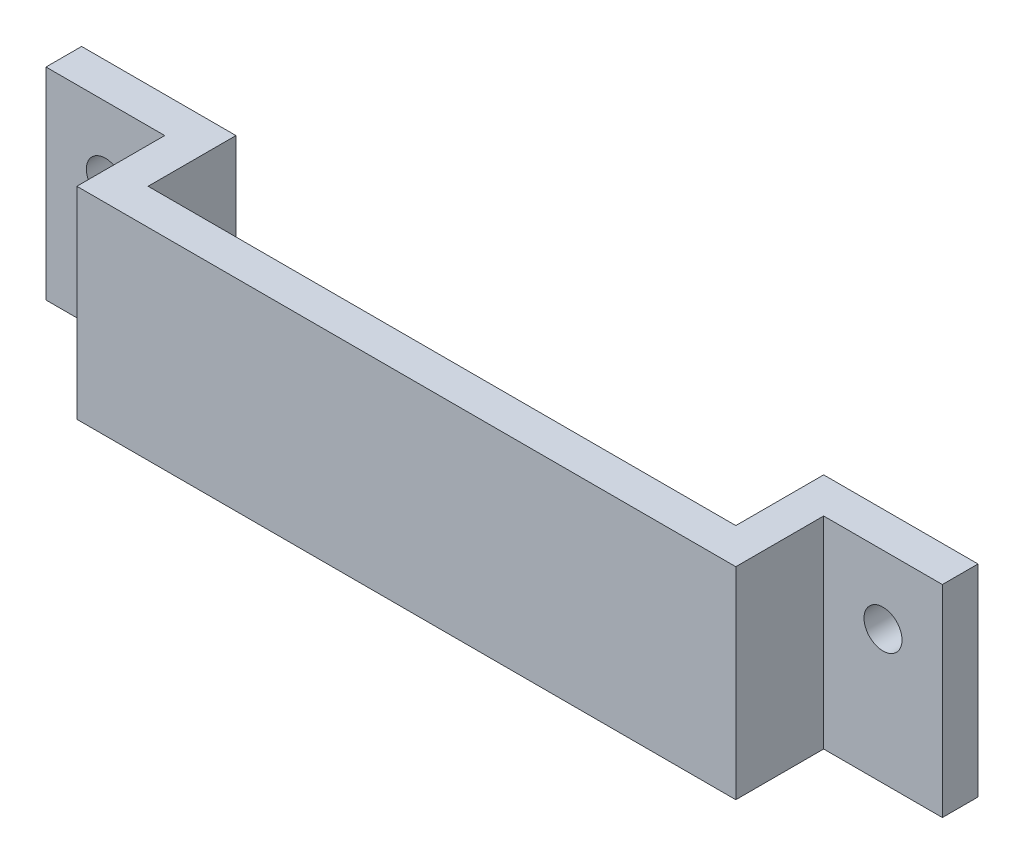
ISO-10303-21;
HEADER;
FILE_DESCRIPTION(('STEP AP214'),'2;1');
FILE_NAME('part.step','',(''),(''),'','','');
FILE_SCHEMA(('AUTOMOTIVE_DESIGN { 1 0 10303 214 1 1 1 1 }'));
ENDSEC;
DATA;
#1=APPLICATION_CONTEXT('core data for automotive mechanical design processes');
#2=APPLICATION_PROTOCOL_DEFINITION('international standard','automotive_design',2000,#1);
#3=PRODUCT_CONTEXT('',#1,'mechanical');
#4=PRODUCT('Part','Part','',(#3));
#5=PRODUCT_RELATED_PRODUCT_CATEGORY('part','',(#4));
#6=PRODUCT_DEFINITION_FORMATION('','',#4);
#7=PRODUCT_DEFINITION_CONTEXT('part definition',#1,'design');
#8=PRODUCT_DEFINITION('design','',#6,#7);
#9=PRODUCT_DEFINITION_SHAPE('','',#8);
#10=(LENGTH_UNIT() NAMED_UNIT(*) SI_UNIT(.MILLI.,.METRE.));
#11=(NAMED_UNIT(*) PLANE_ANGLE_UNIT() SI_UNIT($,.RADIAN.));
#12=(NAMED_UNIT(*) SI_UNIT($,.STERADIAN.) SOLID_ANGLE_UNIT());
#13=UNCERTAINTY_MEASURE_WITH_UNIT(LENGTH_MEASURE(1.E-05),#10,'distance_accuracy_value','');
#14=(GEOMETRIC_REPRESENTATION_CONTEXT(3) GLOBAL_UNCERTAINTY_ASSIGNED_CONTEXT((#13)) GLOBAL_UNIT_ASSIGNED_CONTEXT((#10,
#11,#12)) REPRESENTATION_CONTEXT('',''));
#15=CARTESIAN_POINT('',(0.,0.,0.));
#16=DIRECTION('',(0.,0.,1.));
#17=DIRECTION('',(1.,0.,0.));
#18=AXIS2_PLACEMENT_3D('',#15,#16,#17);
#19=CARTESIAN_POINT('',(-27.75,8.5,3.));
#20=DIRECTION('',(1.,0.,0.));
#21=DIRECTION('',(0.,0.,-1.));
#22=AXIS2_PLACEMENT_3D('',#19,#20,#21);
#23=PLANE('',#22);
#24=DIRECTION('',(0.,1.,0.));
#25=VECTOR('',#24,1.);
#26=CARTESIAN_POINT('',(-27.75,-8.5,-4.39999999999999));
#27=LINE('',#26,#25);
#28=CARTESIAN_POINT('',(-27.75,-8.5,-4.39999999999999));
#29=VERTEX_POINT('',#28);
#30=CARTESIAN_POINT('',(-27.75,8.5,-4.39999999999999));
#31=VERTEX_POINT('',#30);
#32=EDGE_CURVE('E55',#29,#31,#27,.T.);
#33=ORIENTED_EDGE('',*,*,#32,.F.);
#34=DIRECTION('',(0.,0.,-1.));
#35=VECTOR('',#34,1.);
#36=CARTESIAN_POINT('',(-27.75,-8.5,3.));
#37=LINE('',#36,#35);
#38=CARTESIAN_POINT('',(-27.75,-8.5,3.));
#39=VERTEX_POINT('',#38);
#40=EDGE_CURVE('E11',#39,#29,#37,.T.);
#41=ORIENTED_EDGE('',*,*,#40,.F.);
#42=DIRECTION('',(0.,-1.,0.));
#43=VECTOR('',#42,1.);
#44=CARTESIAN_POINT('',(-27.75,8.5,3.));
#45=LINE('',#44,#43);
#46=CARTESIAN_POINT('',(-27.75,8.5,3.));
#47=VERTEX_POINT('',#46);
#48=EDGE_CURVE('E157',#47,#39,#45,.T.);
#49=ORIENTED_EDGE('',*,*,#48,.F.);
#50=DIRECTION('',(0.,0.,-1.));
#51=VECTOR('',#50,1.);
#52=CARTESIAN_POINT('',(-27.75,8.5,3.));
#53=LINE('',#52,#51);
#54=EDGE_CURVE('E149',#47,#31,#53,.T.);
#55=ORIENTED_EDGE('',*,*,#54,.T.);
#56=EDGE_LOOP('',(#33,#41,#49,#55));
#57=FACE_BOUND('',#56,.T.);
#58=ADVANCED_FACE('F41',(#57),#23,.F.);
#59=CARTESIAN_POINT('',(0.,0.,0.));
#60=DIRECTION('',(0.,0.,1.));
#61=DIRECTION('',(1.,0.,0.));
#62=AXIS2_PLACEMENT_3D('',#59,#60,#61);
#63=PLANE('',#62);
#64=DIRECTION('',(-1.,0.,0.));
#65=VECTOR('',#64,1.);
#66=CARTESIAN_POINT('',(-27.75,8.5,0.));
#67=LINE('',#66,#65);
#68=CARTESIAN_POINT('',(24.75,8.5,0.));
#69=VERTEX_POINT('',#68);
#70=CARTESIAN_POINT('',(-24.75,8.5,0.));
#71=VERTEX_POINT('',#70);
#72=EDGE_CURVE('E154',#69,#71,#67,.T.);
#73=ORIENTED_EDGE('',*,*,#72,.F.);
#74=DIRECTION('',(0.,-1.,0.));
#75=VECTOR('',#74,1.);
#76=CARTESIAN_POINT('',(24.75,0.,0.));
#77=LINE('',#76,#75);
#78=CARTESIAN_POINT('',(24.75,-8.5,0.));
#79=VERTEX_POINT('',#78);
#80=EDGE_CURVE('E171',#69,#79,#77,.T.);
#81=ORIENTED_EDGE('',*,*,#80,.T.);
#82=DIRECTION('',(1.,0.,0.));
#83=VECTOR('',#82,1.);
#84=CARTESIAN_POINT('',(-27.75,-8.5,0.));
#85=LINE('',#84,#83);
#86=CARTESIAN_POINT('',(-24.75,-8.5,0.));
#87=VERTEX_POINT('',#86);
#88=EDGE_CURVE('E158',#87,#79,#85,.T.);
#89=ORIENTED_EDGE('',*,*,#88,.F.);
#90=DIRECTION('',(0.,-1.,0.));
#91=VECTOR('',#90,1.);
#92=CARTESIAN_POINT('',(-24.75,0.,0.));
#93=LINE('',#92,#91);
#94=EDGE_CURVE('E176',#71,#87,#93,.T.);
#95=ORIENTED_EDGE('',*,*,#94,.F.);
#96=EDGE_LOOP('',(#73,#81,#89,#95));
#97=FACE_BOUND('',#96,.T.);
#98=ADVANCED_FACE('F289',(#97),#63,.F.);
#99=CARTESIAN_POINT('',(-27.75,-8.5,3.));
#100=DIRECTION('',(0.,1.,0.));
#101=DIRECTION('',(0.,0.,1.));
#102=AXIS2_PLACEMENT_3D('',#99,#100,#101);
#103=PLANE('',#102);
#104=ORIENTED_EDGE('',*,*,#40,.T.);
#105=DIRECTION('',(1.,0.,0.));
#106=VECTOR('',#105,1.);
#107=CARTESIAN_POINT('',(-27.75,-8.5,-4.39999999999999));
#108=LINE('',#107,#106);
#109=CARTESIAN_POINT('',(-37.75,-8.5,-4.39999999999999));
#110=VERTEX_POINT('',#109);
#111=EDGE_CURVE('E202',#110,#29,#108,.T.);
#112=ORIENTED_EDGE('',*,*,#111,.F.);
#113=DIRECTION('',(0.,0.,1.));
#114=VECTOR('',#113,1.);
#115=CARTESIAN_POINT('',(-37.75,-8.5,-7.39999999999999));
#116=LINE('',#115,#114);
#117=CARTESIAN_POINT('',(-37.75,-8.5,-7.39999999999999));
#118=VERTEX_POINT('',#117);
#119=EDGE_CURVE('E198',#118,#110,#116,.T.);
#120=ORIENTED_EDGE('',*,*,#119,.F.);
#121=DIRECTION('',(-1.,0.,0.));
#122=VECTOR('',#121,1.);
#123=CARTESIAN_POINT('',(0.,-8.5,-7.4));
#124=LINE('',#123,#122);
#125=CARTESIAN_POINT('',(-24.75,-8.5,-7.4));
#126=VERTEX_POINT('',#125);
#127=EDGE_CURVE('E175',#126,#118,#124,.T.);
#128=ORIENTED_EDGE('',*,*,#127,.F.);
#129=DIRECTION('',(0.,0.,1.));
#130=VECTOR('',#129,1.);
#131=CARTESIAN_POINT('',(-24.75,-8.5,-7.4));
#132=LINE('',#131,#130);
#133=EDGE_CURVE('E172',#126,#87,#132,.T.);
#134=ORIENTED_EDGE('',*,*,#133,.T.);
#135=ORIENTED_EDGE('',*,*,#88,.T.);
#136=DIRECTION('',(0.,0.,1.));
#137=VECTOR('',#136,1.);
#138=CARTESIAN_POINT('',(24.75,-8.5,-7.4));
#139=LINE('',#138,#137);
#140=CARTESIAN_POINT('',(24.75,-8.5,-7.4));
#141=VERTEX_POINT('',#140);
#142=EDGE_CURVE('E187',#141,#79,#139,.T.);
#143=ORIENTED_EDGE('',*,*,#142,.F.);
#144=DIRECTION('',(-1.,0.,0.));
#145=VECTOR('',#144,1.);
#146=CARTESIAN_POINT('',(0.,-8.5,-7.4));
#147=LINE('',#146,#145);
#148=CARTESIAN_POINT('',(37.75,-8.5,-7.4));
#149=VERTEX_POINT('',#148);
#150=EDGE_CURVE('E189',#149,#141,#147,.T.);
#151=ORIENTED_EDGE('',*,*,#150,.F.);
#152=DIRECTION('',(0.,0.,-1.));
#153=VECTOR('',#152,1.);
#154=CARTESIAN_POINT('',(37.75,-8.5,-7.4));
#155=LINE('',#154,#153);
#156=CARTESIAN_POINT('',(37.75,-8.5,-4.4));
#157=VERTEX_POINT('',#156);
#158=EDGE_CURVE('E136',#157,#149,#155,.T.);
#159=ORIENTED_EDGE('',*,*,#158,.F.);
#160=DIRECTION('',(1.,0.,0.));
#161=VECTOR('',#160,1.);
#162=CARTESIAN_POINT('',(27.75,-8.5,-4.4));
#163=LINE('',#162,#161);
#164=CARTESIAN_POINT('',(27.75,-8.5,-4.4));
#165=VERTEX_POINT('',#164);
#166=EDGE_CURVE('E130',#165,#157,#163,.T.);
#167=ORIENTED_EDGE('',*,*,#166,.F.);
#168=DIRECTION('',(0.,0.,-1.));
#169=VECTOR('',#168,1.);
#170=CARTESIAN_POINT('',(27.75,-8.5,3.));
#171=LINE('',#170,#169);
#172=CARTESIAN_POINT('',(27.75,-8.5,3.));
#173=VERTEX_POINT('',#172);
#174=EDGE_CURVE('E48',#173,#165,#171,.T.);
#175=ORIENTED_EDGE('',*,*,#174,.F.);
#176=DIRECTION('',(1.,0.,0.));
#177=VECTOR('',#176,1.);
#178=CARTESIAN_POINT('',(-27.75,-8.5,3.));
#179=LINE('',#178,#177);
#180=EDGE_CURVE('E164',#39,#173,#179,.T.);
#181=ORIENTED_EDGE('',*,*,#180,.F.);
#182=EDGE_LOOP('',(#104,#112,#120,#128,#134,#135,#143,#151,#159,#167,#175,#181));
#183=FACE_BOUND('',#182,.T.);
#184=ADVANCED_FACE('F141',(#183),#103,.F.);
#185=CARTESIAN_POINT('',(27.75,8.5,3.));
#186=DIRECTION('',(-1.,0.,0.));
#187=DIRECTION('',(0.,0.,1.));
#188=AXIS2_PLACEMENT_3D('',#185,#186,#187);
#189=PLANE('',#188);
#190=ORIENTED_EDGE('',*,*,#174,.T.);
#191=DIRECTION('',(0.,1.,0.));
#192=VECTOR('',#191,1.);
#193=CARTESIAN_POINT('',(27.75,-8.5,-4.4));
#194=LINE('',#193,#192);
#195=CARTESIAN_POINT('',(27.75,8.5,-4.4));
#196=VERTEX_POINT('',#195);
#197=EDGE_CURVE('E127',#165,#196,#194,.T.);
#198=ORIENTED_EDGE('',*,*,#197,.T.);
#199=DIRECTION('',(0.,0.,-1.));
#200=VECTOR('',#199,1.);
#201=CARTESIAN_POINT('',(27.75,8.5,3.));
#202=LINE('',#201,#200);
#203=CARTESIAN_POINT('',(27.75,8.5,3.));
#204=VERTEX_POINT('',#203);
#205=EDGE_CURVE('E148',#204,#196,#202,.T.);
#206=ORIENTED_EDGE('',*,*,#205,.F.);
#207=DIRECTION('',(0.,1.,0.));
#208=VECTOR('',#207,1.);
#209=CARTESIAN_POINT('',(27.75,8.5,3.));
#210=LINE('',#209,#208);
#211=EDGE_CURVE('E147',#173,#204,#210,.T.);
#212=ORIENTED_EDGE('',*,*,#211,.F.);
#213=EDGE_LOOP('',(#190,#198,#206,#212));
#214=FACE_BOUND('',#213,.T.);
#215=ADVANCED_FACE('F146',(#214),#189,.F.);
#216=CARTESIAN_POINT('',(-27.75,8.5,3.));
#217=DIRECTION('',(0.,-1.,0.));
#218=DIRECTION('',(0.,0.,-1.));
#219=AXIS2_PLACEMENT_3D('',#216,#217,#218);
#220=PLANE('',#219);
#221=ORIENTED_EDGE('',*,*,#205,.T.);
#222=DIRECTION('',(1.,0.,0.));
#223=VECTOR('',#222,1.);
#224=CARTESIAN_POINT('',(27.75,8.5,-4.4));
#225=LINE('',#224,#223);
#226=CARTESIAN_POINT('',(37.75,8.5,-4.4));
#227=VERTEX_POINT('',#226);
#228=EDGE_CURVE('E62',#196,#227,#225,.T.);
#229=ORIENTED_EDGE('',*,*,#228,.T.);
#230=DIRECTION('',(0.,0.,-1.));
#231=VECTOR('',#230,1.);
#232=CARTESIAN_POINT('',(37.75,8.5,-7.4));
#233=LINE('',#232,#231);
#234=CARTESIAN_POINT('',(37.75,8.5,-7.4));
#235=VERTEX_POINT('',#234);
#236=EDGE_CURVE('E144',#227,#235,#233,.T.);
#237=ORIENTED_EDGE('',*,*,#236,.T.);
#238=DIRECTION('',(1.,0.,0.));
#239=VECTOR('',#238,1.);
#240=CARTESIAN_POINT('',(0.,8.5,-7.4));
#241=LINE('',#240,#239);
#242=CARTESIAN_POINT('',(24.75,8.5,-7.4));
#243=VERTEX_POINT('',#242);
#244=EDGE_CURVE('E194',#243,#235,#241,.T.);
#245=ORIENTED_EDGE('',*,*,#244,.F.);
#246=DIRECTION('',(0.,0.,1.));
#247=VECTOR('',#246,1.);
#248=CARTESIAN_POINT('',(24.75,8.5,-7.4));
#249=LINE('',#248,#247);
#250=EDGE_CURVE('E161',#243,#69,#249,.T.);
#251=ORIENTED_EDGE('',*,*,#250,.T.);
#252=ORIENTED_EDGE('',*,*,#72,.T.);
#253=DIRECTION('',(0.,0.,1.));
#254=VECTOR('',#253,1.);
#255=CARTESIAN_POINT('',(-24.75,8.5,-7.4));
#256=LINE('',#255,#254);
#257=CARTESIAN_POINT('',(-24.75,8.5,-7.4));
#258=VERTEX_POINT('',#257);
#259=EDGE_CURVE('E168',#258,#71,#256,.T.);
#260=ORIENTED_EDGE('',*,*,#259,.F.);
#261=DIRECTION('',(1.,0.,0.));
#262=VECTOR('',#261,1.);
#263=CARTESIAN_POINT('',(0.,8.5,-7.4));
#264=LINE('',#263,#262);
#265=CARTESIAN_POINT('',(-37.75,8.5,-7.39999999999999));
#266=VERTEX_POINT('',#265);
#267=EDGE_CURVE('E179',#266,#258,#264,.T.);
#268=ORIENTED_EDGE('',*,*,#267,.F.);
#269=DIRECTION('',(0.,0.,1.));
#270=VECTOR('',#269,1.);
#271=CARTESIAN_POINT('',(-37.75,8.5,-7.39999999999999));
#272=LINE('',#271,#270);
#273=CARTESIAN_POINT('',(-37.75,8.5,-4.39999999999999));
#274=VERTEX_POINT('',#273);
#275=EDGE_CURVE('E206',#266,#274,#272,.T.);
#276=ORIENTED_EDGE('',*,*,#275,.T.);
#277=DIRECTION('',(1.,0.,0.));
#278=VECTOR('',#277,1.);
#279=CARTESIAN_POINT('',(-27.75,8.5,-4.39999999999999));
#280=LINE('',#279,#278);
#281=EDGE_CURVE('E201',#274,#31,#280,.T.);
#282=ORIENTED_EDGE('',*,*,#281,.T.);
#283=ORIENTED_EDGE('',*,*,#54,.F.);
#284=DIRECTION('',(-1.,0.,0.));
#285=VECTOR('',#284,1.);
#286=CARTESIAN_POINT('',(-27.75,8.5,3.));
#287=LINE('',#286,#285);
#288=EDGE_CURVE('E153',#204,#47,#287,.T.);
#289=ORIENTED_EDGE('',*,*,#288,.F.);
#290=EDGE_LOOP('',(#221,#229,#237,#245,#251,#252,#260,#268,#276,#282,#283,#289));
#291=FACE_BOUND('',#290,.T.);
#292=ADVANCED_FACE('F248',(#291),#220,.F.);
#293=CARTESIAN_POINT('',(0.,0.,3.));
#294=DIRECTION('',(0.,0.,1.));
#295=DIRECTION('',(1.,0.,0.));
#296=AXIS2_PLACEMENT_3D('',#293,#294,#295);
#297=PLANE('',#296);
#298=ORIENTED_EDGE('',*,*,#48,.T.);
#299=ORIENTED_EDGE('',*,*,#180,.T.);
#300=ORIENTED_EDGE('',*,*,#211,.T.);
#301=ORIENTED_EDGE('',*,*,#288,.T.);
#302=EDGE_LOOP('',(#298,#299,#300,#301));
#303=FACE_BOUND('',#302,.T.);
#304=ADVANCED_FACE('F256',(#303),#297,.T.);
#305=CARTESIAN_POINT('',(-24.75,0.,-7.4));
#306=DIRECTION('',(-1.,0.,0.));
#307=DIRECTION('',(0.,0.,1.));
#308=AXIS2_PLACEMENT_3D('',#305,#306,#307);
#309=PLANE('',#308);
#310=ORIENTED_EDGE('',*,*,#94,.T.);
#311=ORIENTED_EDGE('',*,*,#133,.F.);
#312=DIRECTION('',(0.,-1.,0.));
#313=VECTOR('',#312,1.);
#314=CARTESIAN_POINT('',(-24.75,0.,-7.4));
#315=LINE('',#314,#313);
#316=EDGE_CURVE('E182',#258,#126,#315,.T.);
#317=ORIENTED_EDGE('',*,*,#316,.F.);
#318=ORIENTED_EDGE('',*,*,#259,.T.);
#319=EDGE_LOOP('',(#310,#311,#317,#318));
#320=FACE_BOUND('',#319,.T.);
#321=ADVANCED_FACE('F273',(#320),#309,.F.);
#322=CARTESIAN_POINT('',(0.,0.,-7.4));
#323=DIRECTION('',(0.,0.,-1.));
#324=DIRECTION('',(-1.,0.,0.));
#325=AXIS2_PLACEMENT_3D('',#322,#323,#324);
#326=PLANE('',#325);
#327=CARTESIAN_POINT('',(-32.75,2.75,-7.4));
#328=DIRECTION('',(0.,0.,-1.));
#329=DIRECTION('',(-1.,0.,0.));
#330=AXIS2_PLACEMENT_3D('',#327,#328,#329);
#331=CIRCLE('',#330,1.60000000000001);
#332=CARTESIAN_POINT('',(-34.35,2.75,-7.4));
#333=VERTEX_POINT('',#332);
#334=EDGE_CURVE('E230',#333,#333,#331,.F.);
#335=ORIENTED_EDGE('',*,*,#334,.T.);
#336=EDGE_LOOP('',(#335));
#337=FACE_BOUND('',#336,.T.);
#338=ORIENTED_EDGE('',*,*,#267,.T.);
#339=ORIENTED_EDGE('',*,*,#316,.T.);
#340=ORIENTED_EDGE('',*,*,#127,.T.);
#341=DIRECTION('',(0.,1.,0.));
#342=VECTOR('',#341,1.);
#343=CARTESIAN_POINT('',(-37.75,-8.5,-7.39999999999999));
#344=LINE('',#343,#342);
#345=EDGE_CURVE('E205',#118,#266,#344,.T.);
#346=ORIENTED_EDGE('',*,*,#345,.T.);
#347=EDGE_LOOP('',(#338,#339,#340,#346));
#348=FACE_BOUND('',#347,.T.);
#349=ADVANCED_FACE('F276',(#337,#348),#326,.T.);
#350=CARTESIAN_POINT('',(24.75,0.,-7.4));
#351=DIRECTION('',(-1.,0.,0.));
#352=DIRECTION('',(0.,0.,1.));
#353=AXIS2_PLACEMENT_3D('',#350,#351,#352);
#354=PLANE('',#353);
#355=ORIENTED_EDGE('',*,*,#80,.F.);
#356=ORIENTED_EDGE('',*,*,#250,.F.);
#357=DIRECTION('',(0.,-1.,0.));
#358=VECTOR('',#357,1.);
#359=CARTESIAN_POINT('',(24.75,0.,-7.4));
#360=LINE('',#359,#358);
#361=EDGE_CURVE('E192',#243,#141,#360,.T.);
#362=ORIENTED_EDGE('',*,*,#361,.T.);
#363=ORIENTED_EDGE('',*,*,#142,.T.);
#364=EDGE_LOOP('',(#355,#356,#362,#363));
#365=FACE_BOUND('',#364,.T.);
#366=ADVANCED_FACE('F269',(#365),#354,.T.);
#367=CARTESIAN_POINT('',(0.,0.,-7.4));
#368=DIRECTION('',(0.,0.,-1.));
#369=DIRECTION('',(-1.,0.,0.));
#370=AXIS2_PLACEMENT_3D('',#367,#368,#369);
#371=PLANE('',#370);
#372=CARTESIAN_POINT('',(32.75,2.75,-7.4));
#373=DIRECTION('',(0.,0.,-1.));
#374=DIRECTION('',(-1.,0.,0.));
#375=AXIS2_PLACEMENT_3D('',#372,#373,#374);
#376=CIRCLE('',#375,1.6);
#377=CARTESIAN_POINT('',(31.15,2.75,-7.4));
#378=VERTEX_POINT('',#377);
#379=EDGE_CURVE('E227',#378,#378,#376,.F.);
#380=ORIENTED_EDGE('',*,*,#379,.T.);
#381=EDGE_LOOP('',(#380));
#382=FACE_BOUND('',#381,.T.);
#383=ORIENTED_EDGE('',*,*,#361,.F.);
#384=ORIENTED_EDGE('',*,*,#244,.T.);
#385=DIRECTION('',(0.,1.,0.));
#386=VECTOR('',#385,1.);
#387=CARTESIAN_POINT('',(37.75,-8.5,-7.4));
#388=LINE('',#387,#386);
#389=EDGE_CURVE('E180',#149,#235,#388,.T.);
#390=ORIENTED_EDGE('',*,*,#389,.F.);
#391=ORIENTED_EDGE('',*,*,#150,.T.);
#392=EDGE_LOOP('',(#383,#384,#390,#391));
#393=FACE_BOUND('',#392,.T.);
#394=ADVANCED_FACE('F265',(#382,#393),#371,.T.);
#395=CARTESIAN_POINT('',(37.75,-8.5,-7.4));
#396=DIRECTION('',(1.,0.,0.));
#397=DIRECTION('',(0.,0.,-1.));
#398=AXIS2_PLACEMENT_3D('',#395,#396,#397);
#399=PLANE('',#398);
#400=ORIENTED_EDGE('',*,*,#236,.F.);
#401=DIRECTION('',(0.,1.,0.));
#402=VECTOR('',#401,1.);
#403=CARTESIAN_POINT('',(37.75,-8.5,-4.4));
#404=LINE('',#403,#402);
#405=EDGE_CURVE('E135',#157,#227,#404,.T.);
#406=ORIENTED_EDGE('',*,*,#405,.F.);
#407=ORIENTED_EDGE('',*,*,#158,.T.);
#408=ORIENTED_EDGE('',*,*,#389,.T.);
#409=EDGE_LOOP('',(#400,#406,#407,#408));
#410=FACE_BOUND('',#409,.T.);
#411=ADVANCED_FACE('F262',(#410),#399,.T.);
#412=CARTESIAN_POINT('',(27.75,-8.5,-4.4));
#413=DIRECTION('',(0.,0.,1.));
#414=DIRECTION('',(1.,0.,0.));
#415=AXIS2_PLACEMENT_3D('',#412,#413,#414);
#416=PLANE('',#415);
#417=CARTESIAN_POINT('',(32.75,2.75,-4.4));
#418=DIRECTION('',(0.,0.,1.));
#419=DIRECTION('',(-1.,0.,0.));
#420=AXIS2_PLACEMENT_3D('',#417,#418,#419);
#421=CIRCLE('',#420,1.6);
#422=CARTESIAN_POINT('',(31.15,2.75,-4.4));
#423=VERTEX_POINT('',#422);
#424=EDGE_CURVE('E224',#423,#423,#421,.T.);
#425=ORIENTED_EDGE('',*,*,#424,.F.);
#426=EDGE_LOOP('',(#425));
#427=FACE_BOUND('',#426,.T.);
#428=ORIENTED_EDGE('',*,*,#228,.F.);
#429=ORIENTED_EDGE('',*,*,#197,.F.);
#430=ORIENTED_EDGE('',*,*,#166,.T.);
#431=ORIENTED_EDGE('',*,*,#405,.T.);
#432=EDGE_LOOP('',(#428,#429,#430,#431));
#433=FACE_BOUND('',#432,.T.);
#434=ADVANCED_FACE('F129',(#427,#433),#416,.T.);
#435=CARTESIAN_POINT('',(-27.75,-8.5,-4.39999999999999));
#436=DIRECTION('',(0.,0.,1.));
#437=DIRECTION('',(1.,0.,0.));
#438=AXIS2_PLACEMENT_3D('',#435,#436,#437);
#439=PLANE('',#438);
#440=CARTESIAN_POINT('',(-32.75,2.75,-4.4));
#441=DIRECTION('',(0.,0.,1.));
#442=DIRECTION('',(1.,0.,0.));
#443=AXIS2_PLACEMENT_3D('',#440,#441,#442);
#444=CIRCLE('',#443,1.60000000000001);
#445=CARTESIAN_POINT('',(-31.15,2.75,-4.4));
#446=VERTEX_POINT('',#445);
#447=EDGE_CURVE('E213',#446,#446,#444,.T.);
#448=ORIENTED_EDGE('',*,*,#447,.F.);
#449=EDGE_LOOP('',(#448));
#450=FACE_BOUND('',#449,.T.);
#451=ORIENTED_EDGE('',*,*,#281,.F.);
#452=DIRECTION('',(0.,1.,0.));
#453=VECTOR('',#452,1.);
#454=CARTESIAN_POINT('',(-37.75,-8.5,-4.39999999999999));
#455=LINE('',#454,#453);
#456=EDGE_CURVE('E212',#110,#274,#455,.T.);
#457=ORIENTED_EDGE('',*,*,#456,.F.);
#458=ORIENTED_EDGE('',*,*,#111,.T.);
#459=ORIENTED_EDGE('',*,*,#32,.T.);
#460=EDGE_LOOP('',(#451,#457,#458,#459));
#461=FACE_BOUND('',#460,.T.);
#462=ADVANCED_FACE('F238',(#450,#461),#439,.T.);
#463=CARTESIAN_POINT('',(-37.75,-8.5,-7.39999999999999));
#464=DIRECTION('',(-1.,0.,0.));
#465=DIRECTION('',(0.,0.,1.));
#466=AXIS2_PLACEMENT_3D('',#463,#464,#465);
#467=PLANE('',#466);
#468=ORIENTED_EDGE('',*,*,#275,.F.);
#469=ORIENTED_EDGE('',*,*,#345,.F.);
#470=ORIENTED_EDGE('',*,*,#119,.T.);
#471=ORIENTED_EDGE('',*,*,#456,.T.);
#472=EDGE_LOOP('',(#468,#469,#470,#471));
#473=FACE_BOUND('',#472,.T.);
#474=ADVANCED_FACE('F241',(#473),#467,.T.);
#475=CARTESIAN_POINT('',(-32.75,2.75,-7.401));
#476=DIRECTION('',(0.,0.,1.));
#477=DIRECTION('',(1.,0.,0.));
#478=AXIS2_PLACEMENT_3D('',#475,#476,#477);
#479=CYLINDRICAL_SURFACE('',#478,1.60000000000001);
#480=ORIENTED_EDGE('',*,*,#334,.F.);
#481=EDGE_LOOP('',(#480));
#482=FACE_BOUND('',#481,.T.);
#483=ORIENTED_EDGE('',*,*,#447,.T.);
#484=EDGE_LOOP('',(#483));
#485=FACE_BOUND('',#484,.T.);
#486=ADVANCED_FACE('F236',(#482,#485),#479,.F.);
#487=CARTESIAN_POINT('',(32.75,2.75,-7.401));
#488=DIRECTION('',(0.,0.,1.));
#489=DIRECTION('',(1.,0.,0.));
#490=AXIS2_PLACEMENT_3D('',#487,#488,#489);
#491=CYLINDRICAL_SURFACE('',#490,1.6);
#492=ORIENTED_EDGE('',*,*,#379,.F.);
#493=EDGE_LOOP('',(#492));
#494=FACE_BOUND('',#493,.T.);
#495=ORIENTED_EDGE('',*,*,#424,.T.);
#496=EDGE_LOOP('',(#495));
#497=FACE_BOUND('',#496,.T.);
#498=ADVANCED_FACE('F342',(#494,#497),#491,.F.);
#499=CLOSED_SHELL('',(#58,#98,#184,#215,#292,#304,#321,#349,#366,#394,#411,#434,#462,#474,#486,#498));
#500=MANIFOLD_SOLID_BREP('B2',#499);
#501=ADVANCED_BREP_SHAPE_REPRESENTATION('',(#18,#500),#14);
#502=SHAPE_DEFINITION_REPRESENTATION(#9,#501);
ENDSEC;
END-ISO-10303-21;
